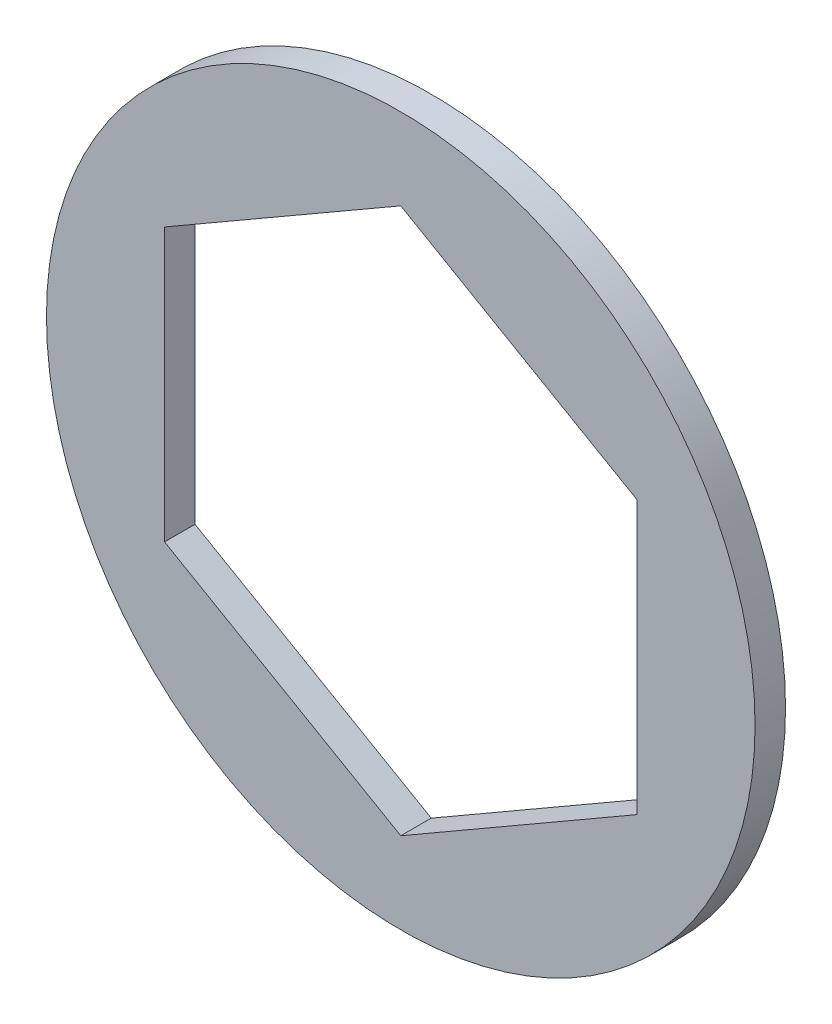
ISO-10303-21;
HEADER;
FILE_DESCRIPTION(('STEP AP214'),'2;1');
FILE_NAME('part.step','',(''),(''),'','','');
FILE_SCHEMA(('AUTOMOTIVE_DESIGN { 1 0 10303 214 1 1 1 1 }'));
ENDSEC;
DATA;
#1=APPLICATION_CONTEXT('core data for automotive mechanical design processes');
#2=APPLICATION_PROTOCOL_DEFINITION('international standard','automotive_design',2000,#1);
#3=PRODUCT_CONTEXT('',#1,'mechanical');
#4=PRODUCT('Part','Part','',(#3));
#5=PRODUCT_RELATED_PRODUCT_CATEGORY('part','',(#4));
#6=PRODUCT_DEFINITION_FORMATION('','',#4);
#7=PRODUCT_DEFINITION_CONTEXT('part definition',#1,'design');
#8=PRODUCT_DEFINITION('design','',#6,#7);
#9=PRODUCT_DEFINITION_SHAPE('','',#8);
#10=(LENGTH_UNIT() NAMED_UNIT(*) SI_UNIT(.MILLI.,.METRE.));
#11=(NAMED_UNIT(*) PLANE_ANGLE_UNIT() SI_UNIT($,.RADIAN.));
#12=(NAMED_UNIT(*) SI_UNIT($,.STERADIAN.) SOLID_ANGLE_UNIT());
#13=UNCERTAINTY_MEASURE_WITH_UNIT(LENGTH_MEASURE(1.E-05),#10,'distance_accuracy_value','');
#14=(GEOMETRIC_REPRESENTATION_CONTEXT(3) GLOBAL_UNCERTAINTY_ASSIGNED_CONTEXT((#13)) GLOBAL_UNIT_ASSIGNED_CONTEXT((#10,
#11,#12)) REPRESENTATION_CONTEXT('',''));
#15=CARTESIAN_POINT('',(0.,0.,0.));
#16=DIRECTION('',(0.,0.,1.));
#17=DIRECTION('',(1.,0.,0.));
#18=AXIS2_PLACEMENT_3D('',#15,#16,#17);
#19=CARTESIAN_POINT('',(0.,0.,0.409575));
#20=DIRECTION('',(0.,0.,1.));
#21=DIRECTION('',(1.,0.,0.));
#22=AXIS2_PLACEMENT_3D('',#19,#20,#21);
#23=PLANE('',#22);
#24=CARTESIAN_POINT('',(0.,0.,0.409575));
#25=DIRECTION('',(0.,0.,1.));
#26=DIRECTION('',(1.,0.,0.));
#27=AXIS2_PLACEMENT_3D('',#24,#25,#26);
#28=CIRCLE('',#27,9.525);
#29=CARTESIAN_POINT('',(-9.525,0.,0.409575));
#30=VERTEX_POINT('',#29);
#31=EDGE_CURVE('E11',#30,#30,#28,.T.);
#32=ORIENTED_EDGE('',*,*,#31,.T.);
#33=EDGE_LOOP('',(#32));
#34=FACE_BOUND('',#33,.T.);
#35=DIRECTION('',(-0.866025403784439,-0.5,0.));
#36=VECTOR('',#35,1.);
#37=CARTESIAN_POINT('',(0.,7.33234841870825,0.409575));
#38=LINE('',#37,#36);
#39=CARTESIAN_POINT('',(0.,7.33234841870825,0.409575));
#40=VERTEX_POINT('',#39);
#41=CARTESIAN_POINT('',(-6.35,3.66617420935412,0.409575));
#42=VERTEX_POINT('',#41);
#43=EDGE_CURVE('E106',#40,#42,#38,.T.);
#44=ORIENTED_EDGE('',*,*,#43,.F.);
#45=DIRECTION('',(-0.866025403784439,0.5,0.));
#46=VECTOR('',#45,1.);
#47=CARTESIAN_POINT('',(6.35,3.66617420935412,0.409575));
#48=LINE('',#47,#46);
#49=CARTESIAN_POINT('',(6.35,3.66617420935412,0.409575));
#50=VERTEX_POINT('',#49);
#51=EDGE_CURVE('E97',#50,#40,#48,.T.);
#52=ORIENTED_EDGE('',*,*,#51,.F.);
#53=DIRECTION('',(0.,1.,0.));
#54=VECTOR('',#53,1.);
#55=CARTESIAN_POINT('',(6.35,-3.66617420935412,0.409575));
#56=LINE('',#55,#54);
#57=CARTESIAN_POINT('',(6.35,-3.66617420935412,0.409575));
#58=VERTEX_POINT('',#57);
#59=EDGE_CURVE('E131',#58,#50,#56,.T.);
#60=ORIENTED_EDGE('',*,*,#59,.F.);
#61=DIRECTION('',(0.866025403784439,0.5,0.));
#62=VECTOR('',#61,1.);
#63=CARTESIAN_POINT('',(0.,-7.33234841870825,0.409575));
#64=LINE('',#63,#62);
#65=CARTESIAN_POINT('',(0.,-7.33234841870825,0.409575));
#66=VERTEX_POINT('',#65);
#67=EDGE_CURVE('E128',#66,#58,#64,.T.);
#68=ORIENTED_EDGE('',*,*,#67,.F.);
#69=DIRECTION('',(0.866025403784438,-0.5,0.));
#70=VECTOR('',#69,1.);
#71=CARTESIAN_POINT('',(-6.35,-3.66617420935412,0.409575));
#72=LINE('',#71,#70);
#73=CARTESIAN_POINT('',(-6.35,-3.66617420935412,0.409575));
#74=VERTEX_POINT('',#73);
#75=EDGE_CURVE('E123',#74,#66,#72,.T.);
#76=ORIENTED_EDGE('',*,*,#75,.F.);
#77=DIRECTION('',(0.,-1.,0.));
#78=VECTOR('',#77,1.);
#79=CARTESIAN_POINT('',(-6.35,3.66617420935412,0.409575));
#80=LINE('',#79,#78);
#81=EDGE_CURVE('E119',#42,#74,#80,.T.);
#82=ORIENTED_EDGE('',*,*,#81,.F.);
#83=EDGE_LOOP('',(#44,#52,#60,#68,#76,#82));
#84=FACE_BOUND('',#83,.T.);
#85=ADVANCED_FACE('F43',(#34,#84),#23,.T.);
#86=CARTESIAN_POINT('',(0.,0.,-0.409575));
#87=DIRECTION('',(0.,0.,1.));
#88=DIRECTION('',(1.,0.,0.));
#89=AXIS2_PLACEMENT_3D('',#86,#87,#88);
#90=PLANE('',#89);
#91=CARTESIAN_POINT('',(0.,0.,-0.409575));
#92=DIRECTION('',(0.,0.,1.));
#93=DIRECTION('',(1.,0.,0.));
#94=AXIS2_PLACEMENT_3D('',#91,#92,#93);
#95=CIRCLE('',#94,9.525);
#96=CARTESIAN_POINT('',(-9.525,0.,-0.409575));
#97=VERTEX_POINT('',#96);
#98=EDGE_CURVE('E47',#97,#97,#95,.T.);
#99=ORIENTED_EDGE('',*,*,#98,.F.);
#100=EDGE_LOOP('',(#99));
#101=FACE_BOUND('',#100,.T.);
#102=DIRECTION('',(-0.866025403784439,0.5,0.));
#103=VECTOR('',#102,1.);
#104=CARTESIAN_POINT('',(6.35,3.66617420935412,-0.409575));
#105=LINE('',#104,#103);
#106=CARTESIAN_POINT('',(6.35,3.66617420935412,-0.409575));
#107=VERTEX_POINT('',#106);
#108=CARTESIAN_POINT('',(0.,7.33234841870825,-0.409575));
#109=VERTEX_POINT('',#108);
#110=EDGE_CURVE('E67',#107,#109,#105,.T.);
#111=ORIENTED_EDGE('',*,*,#110,.T.);
#112=DIRECTION('',(-0.866025403784439,-0.5,0.));
#113=VECTOR('',#112,1.);
#114=CARTESIAN_POINT('',(0.,7.33234841870825,-0.409575));
#115=LINE('',#114,#113);
#116=CARTESIAN_POINT('',(-6.35,3.66617420935412,-0.409575));
#117=VERTEX_POINT('',#116);
#118=EDGE_CURVE('E113',#109,#117,#115,.T.);
#119=ORIENTED_EDGE('',*,*,#118,.T.);
#120=DIRECTION('',(0.,-1.,0.));
#121=VECTOR('',#120,1.);
#122=CARTESIAN_POINT('',(-6.35,3.66617420935412,-0.409575));
#123=LINE('',#122,#121);
#124=CARTESIAN_POINT('',(-6.35,-3.66617420935412,-0.409575));
#125=VERTEX_POINT('',#124);
#126=EDGE_CURVE('E138',#117,#125,#123,.T.);
#127=ORIENTED_EDGE('',*,*,#126,.T.);
#128=DIRECTION('',(0.866025403784438,-0.5,0.));
#129=VECTOR('',#128,1.);
#130=CARTESIAN_POINT('',(-6.35,-3.66617420935412,-0.409575));
#131=LINE('',#130,#129);
#132=CARTESIAN_POINT('',(0.,-7.33234841870825,-0.409575));
#133=VERTEX_POINT('',#132);
#134=EDGE_CURVE('E142',#125,#133,#131,.T.);
#135=ORIENTED_EDGE('',*,*,#134,.T.);
#136=DIRECTION('',(0.866025403784439,0.5,0.));
#137=VECTOR('',#136,1.);
#138=CARTESIAN_POINT('',(0.,-7.33234841870825,-0.409575));
#139=LINE('',#138,#137);
#140=CARTESIAN_POINT('',(6.35,-3.66617420935412,-0.409575));
#141=VERTEX_POINT('',#140);
#142=EDGE_CURVE('E146',#133,#141,#139,.T.);
#143=ORIENTED_EDGE('',*,*,#142,.T.);
#144=DIRECTION('',(0.,1.,0.));
#145=VECTOR('',#144,1.);
#146=CARTESIAN_POINT('',(6.35,-3.66617420935412,-0.409575));
#147=LINE('',#146,#145);
#148=EDGE_CURVE('E107',#141,#107,#147,.T.);
#149=ORIENTED_EDGE('',*,*,#148,.T.);
#150=EDGE_LOOP('',(#111,#119,#127,#135,#143,#149));
#151=FACE_BOUND('',#150,.T.);
#152=ADVANCED_FACE('F170',(#101,#151),#90,.F.);
#153=CARTESIAN_POINT('',(0.,0.,0.409575));
#154=DIRECTION('',(0.,0.,-1.));
#155=DIRECTION('',(-1.,0.,0.));
#156=AXIS2_PLACEMENT_3D('',#153,#154,#155);
#157=CYLINDRICAL_SURFACE('',#156,9.525);
#158=CARTESIAN_POINT('',(-9.525,0.,0.409575));
#159=CARTESIAN_POINT('',(-9.525,0.,0.4010421875));
#160=CARTESIAN_POINT('',(-9.525,0.,0.392509375));
#161=CARTESIAN_POINT('',(-9.525,0.,0.37544375));
#162=CARTESIAN_POINT('',(-9.525,0.,0.3669109375));
#163=CARTESIAN_POINT('',(-9.525,0.,0.3498453125));
#164=CARTESIAN_POINT('',(-9.525,0.,0.3413125));
#165=CARTESIAN_POINT('',(-9.525,0.,0.324246875));
#166=CARTESIAN_POINT('',(-9.525,0.,0.3157140625));
#167=CARTESIAN_POINT('',(-9.525,0.,0.2986484375));
#168=CARTESIAN_POINT('',(-9.525,0.,0.290115625));
#169=CARTESIAN_POINT('',(-9.525,0.,0.27305));
#170=CARTESIAN_POINT('',(-9.525,0.,0.2645171875));
#171=CARTESIAN_POINT('',(-9.525,0.,0.2474515625));
#172=CARTESIAN_POINT('',(-9.525,0.,0.23891875));
#173=CARTESIAN_POINT('',(-9.525,0.,0.221853125));
#174=CARTESIAN_POINT('',(-9.525,0.,0.2133203125));
#175=CARTESIAN_POINT('',(-9.525,0.,0.1962546875));
#176=CARTESIAN_POINT('',(-9.525,0.,0.187721875));
#177=CARTESIAN_POINT('',(-9.525,0.,0.17065625));
#178=CARTESIAN_POINT('',(-9.525,0.,0.1621234375));
#179=CARTESIAN_POINT('',(-9.525,0.,0.1450578125));
#180=CARTESIAN_POINT('',(-9.525,0.,0.136525));
#181=CARTESIAN_POINT('',(-9.525,0.,0.119459375));
#182=CARTESIAN_POINT('',(-9.525,0.,0.1109265625));
#183=CARTESIAN_POINT('',(-9.525,0.,0.0938609375));
#184=CARTESIAN_POINT('',(-9.525,0.,0.0853281249999999));
#185=CARTESIAN_POINT('',(-9.525,0.,0.0682624999999999));
#186=CARTESIAN_POINT('',(-9.525,0.,0.0597296875));
#187=CARTESIAN_POINT('',(-9.525,0.,0.0426640625));
#188=CARTESIAN_POINT('',(-9.525,0.,0.03413125));
#189=CARTESIAN_POINT('',(-9.525,0.,0.017065625));
#190=CARTESIAN_POINT('',(-9.525,0.,0.00853281249999995));
#191=CARTESIAN_POINT('',(-9.525,0.,-0.00853281250000006));
#192=CARTESIAN_POINT('',(-9.525,0.,-0.0170656250000001));
#193=CARTESIAN_POINT('',(-9.525,0.,-0.0341312500000001));
#194=CARTESIAN_POINT('',(-9.525,0.,-0.0426640625000001));
#195=CARTESIAN_POINT('',(-9.525,0.,-0.0597296875000001));
#196=CARTESIAN_POINT('',(-9.525,0.,-0.0682625000000001));
#197=CARTESIAN_POINT('',(-9.525,0.,-0.085328125));
#198=CARTESIAN_POINT('',(-9.525,0.,-0.0938609375));
#199=CARTESIAN_POINT('',(-9.525,0.,-0.1109265625));
#200=CARTESIAN_POINT('',(-9.525,0.,-0.119459375));
#201=CARTESIAN_POINT('',(-9.525,0.,-0.136525));
#202=CARTESIAN_POINT('',(-9.525,0.,-0.1450578125));
#203=CARTESIAN_POINT('',(-9.525,0.,-0.1621234375));
#204=CARTESIAN_POINT('',(-9.525,0.,-0.17065625));
#205=CARTESIAN_POINT('',(-9.525,0.,-0.187721875));
#206=CARTESIAN_POINT('',(-9.525,0.,-0.1962546875));
#207=CARTESIAN_POINT('',(-9.525,0.,-0.2133203125));
#208=CARTESIAN_POINT('',(-9.525,0.,-0.221853125));
#209=CARTESIAN_POINT('',(-9.525,0.,-0.23891875));
#210=CARTESIAN_POINT('',(-9.525,0.,-0.2474515625));
#211=CARTESIAN_POINT('',(-9.525,0.,-0.2645171875));
#212=CARTESIAN_POINT('',(-9.525,0.,-0.27305));
#213=CARTESIAN_POINT('',(-9.525,0.,-0.290115625));
#214=CARTESIAN_POINT('',(-9.525,0.,-0.2986484375));
#215=CARTESIAN_POINT('',(-9.525,0.,-0.3157140625));
#216=CARTESIAN_POINT('',(-9.525,0.,-0.324246875));
#217=CARTESIAN_POINT('',(-9.525,0.,-0.3413125));
#218=CARTESIAN_POINT('',(-9.525,0.,-0.3498453125));
#219=CARTESIAN_POINT('',(-9.525,0.,-0.3669109375));
#220=CARTESIAN_POINT('',(-9.525,0.,-0.37544375));
#221=CARTESIAN_POINT('',(-9.525,0.,-0.392509375));
#222=CARTESIAN_POINT('',(-9.525,0.,-0.4010421875));
#223=CARTESIAN_POINT('',(-9.525,0.,-0.409575));
#224=B_SPLINE_CURVE_WITH_KNOTS('',3,(#158,#159,#160,#161,#162,#163,#164,#165,#166,#167,#168,
#169,#170,#171,#172,#173,#174,#175,#176,#177,#178,#179,#180,#181,#182,#183,#184,#185,#186,#187,
#188,#189,#190,#191,#192,#193,#194,#195,#196,#197,#198,#199,#200,#201,#202,#203,#204,#205,#206,
#207,#208,#209,#210,#211,#212,#213,#214,#215,#216,#217,#218,#219,#220,#221,#222,#223),
.UNSPECIFIED.,.F.,.F.,(4,2,2,2,2,2,2,2,2,2,2,2,2,2,2,2,2,2,2,2,2,2,2,2,2,2,2,2,2,2,2,2,4),(0.,
0.0255984375,0.051196875,0.0767953125,0.10239375,0.1279921875,0.153590625,0.1791890625,
0.2047875,0.2303859375,0.255984375,0.2815828125,0.30718125,0.3327796875,0.358378125,
0.3839765625,0.409575,0.4351734375,0.460771875,0.4863703125,0.51196875,0.5375671875,0.563165625,
0.5887640625,0.6143625,0.6399609375,0.665559375,0.6911578125,0.71675625,0.7423546875,
0.767953125,0.7935515625,0.81915),.UNSPECIFIED.);
#225=EDGE_CURVE('BSEAM45',#30,#97,#224,.T.);
#226=ORIENTED_EDGE('',*,*,#31,.F.);
#227=ORIENTED_EDGE('',*,*,#98,.T.);
#228=ORIENTED_EDGE('',*,*,#225,.T.);
#229=ORIENTED_EDGE('',*,*,#225,.F.);
#230=EDGE_LOOP('',(#226,#228,#227,#229));
#231=FACE_BOUND('',#230,.T.);
#232=ADVANCED_FACE('F45',(#231),#157,.T.);
#233=CARTESIAN_POINT('',(6.35,3.66617420935412,0.409575));
#234=DIRECTION('',(-0.5,-0.866025403784439,0.));
#235=DIRECTION('',(0.866025403784439,-0.5,0.));
#236=AXIS2_PLACEMENT_3D('',#233,#234,#235);
#237=PLANE('',#236);
#238=ORIENTED_EDGE('',*,*,#110,.F.);
#239=DIRECTION('',(0.,0.,-1.));
#240=VECTOR('',#239,1.);
#241=CARTESIAN_POINT('',(6.35,3.66617420935412,0.409575));
#242=LINE('',#241,#240);
#243=EDGE_CURVE('E101',#50,#107,#242,.T.);
#244=ORIENTED_EDGE('',*,*,#243,.F.);
#245=ORIENTED_EDGE('',*,*,#51,.T.);
#246=DIRECTION('',(0.,0.,-1.));
#247=VECTOR('',#246,1.);
#248=CARTESIAN_POINT('',(0.,7.33234841870825,0.409575));
#249=LINE('',#248,#247);
#250=EDGE_CURVE('E100',#40,#109,#249,.T.);
#251=ORIENTED_EDGE('',*,*,#250,.T.);
#252=EDGE_LOOP('',(#238,#244,#245,#251));
#253=FACE_BOUND('',#252,.T.);
#254=ADVANCED_FACE('F99',(#253),#237,.T.);
#255=CARTESIAN_POINT('',(0.,7.33234841870825,0.409575));
#256=DIRECTION('',(0.5,-0.866025403784439,0.));
#257=DIRECTION('',(0.866025403784439,0.5,0.));
#258=AXIS2_PLACEMENT_3D('',#255,#256,#257);
#259=PLANE('',#258);
#260=ORIENTED_EDGE('',*,*,#118,.F.);
#261=ORIENTED_EDGE('',*,*,#250,.F.);
#262=ORIENTED_EDGE('',*,*,#43,.T.);
#263=DIRECTION('',(0.,0.,-1.));
#264=VECTOR('',#263,1.);
#265=CARTESIAN_POINT('',(-6.35,3.66617420935412,0.409575));
#266=LINE('',#265,#264);
#267=EDGE_CURVE('E115',#42,#117,#266,.T.);
#268=ORIENTED_EDGE('',*,*,#267,.T.);
#269=EDGE_LOOP('',(#260,#261,#262,#268));
#270=FACE_BOUND('',#269,.T.);
#271=ADVANCED_FACE('F110',(#270),#259,.T.);
#272=CARTESIAN_POINT('',(-6.35,3.66617420935412,0.409575));
#273=DIRECTION('',(1.,0.,0.));
#274=DIRECTION('',(0.,1.,0.));
#275=AXIS2_PLACEMENT_3D('',#272,#273,#274);
#276=PLANE('',#275);
#277=ORIENTED_EDGE('',*,*,#126,.F.);
#278=ORIENTED_EDGE('',*,*,#267,.F.);
#279=ORIENTED_EDGE('',*,*,#81,.T.);
#280=DIRECTION('',(0.,0.,-1.));
#281=VECTOR('',#280,1.);
#282=CARTESIAN_POINT('',(-6.35,-3.66617420935412,0.409575));
#283=LINE('',#282,#281);
#284=EDGE_CURVE('E160',#74,#125,#283,.T.);
#285=ORIENTED_EDGE('',*,*,#284,.T.);
#286=EDGE_LOOP('',(#277,#278,#279,#285));
#287=FACE_BOUND('',#286,.T.);
#288=ADVANCED_FACE('F166',(#287),#276,.T.);
#289=CARTESIAN_POINT('',(-6.35,-3.66617420935412,0.409575));
#290=DIRECTION('',(0.5,0.866025403784438,0.));
#291=DIRECTION('',(-0.866025403784439,0.5,0.));
#292=AXIS2_PLACEMENT_3D('',#289,#290,#291);
#293=PLANE('',#292);
#294=ORIENTED_EDGE('',*,*,#134,.F.);
#295=ORIENTED_EDGE('',*,*,#284,.F.);
#296=ORIENTED_EDGE('',*,*,#75,.T.);
#297=DIRECTION('',(0.,0.,-1.));
#298=VECTOR('',#297,1.);
#299=CARTESIAN_POINT('',(0.,-7.33234841870825,0.409575));
#300=LINE('',#299,#298);
#301=EDGE_CURVE('E157',#66,#133,#300,.T.);
#302=ORIENTED_EDGE('',*,*,#301,.T.);
#303=EDGE_LOOP('',(#294,#295,#296,#302));
#304=FACE_BOUND('',#303,.T.);
#305=ADVANCED_FACE('F178',(#304),#293,.T.);
#306=CARTESIAN_POINT('',(0.,-7.33234841870825,0.409575));
#307=DIRECTION('',(-0.5,0.866025403784439,0.));
#308=DIRECTION('',(-0.866025403784439,-0.5,0.));
#309=AXIS2_PLACEMENT_3D('',#306,#307,#308);
#310=PLANE('',#309);
#311=ORIENTED_EDGE('',*,*,#142,.F.);
#312=ORIENTED_EDGE('',*,*,#301,.F.);
#313=ORIENTED_EDGE('',*,*,#67,.T.);
#314=DIRECTION('',(0.,0.,-1.));
#315=VECTOR('',#314,1.);
#316=CARTESIAN_POINT('',(6.35,-3.66617420935412,0.409575));
#317=LINE('',#316,#315);
#318=EDGE_CURVE('E59',#58,#141,#317,.T.);
#319=ORIENTED_EDGE('',*,*,#318,.T.);
#320=EDGE_LOOP('',(#311,#312,#313,#319));
#321=FACE_BOUND('',#320,.T.);
#322=ADVANCED_FACE('F176',(#321),#310,.T.);
#323=CARTESIAN_POINT('',(6.35,-3.66617420935412,0.409575));
#324=DIRECTION('',(-1.,0.,0.));
#325=DIRECTION('',(0.,-1.,0.));
#326=AXIS2_PLACEMENT_3D('',#323,#324,#325);
#327=PLANE('',#326);
#328=ORIENTED_EDGE('',*,*,#148,.F.);
#329=ORIENTED_EDGE('',*,*,#318,.F.);
#330=ORIENTED_EDGE('',*,*,#59,.T.);
#331=ORIENTED_EDGE('',*,*,#243,.T.);
#332=EDGE_LOOP('',(#328,#329,#330,#331));
#333=FACE_BOUND('',#332,.T.);
#334=ADVANCED_FACE('F172',(#333),#327,.T.);
#335=CLOSED_SHELL('',(#85,#152,#232,#254,#271,#288,#305,#322,#334));
#336=MANIFOLD_SOLID_BREP('B2',#335);
#337=ADVANCED_BREP_SHAPE_REPRESENTATION('',(#18,#336),#14);
#338=SHAPE_DEFINITION_REPRESENTATION(#9,#337);
ENDSEC;
END-ISO-10303-21;
